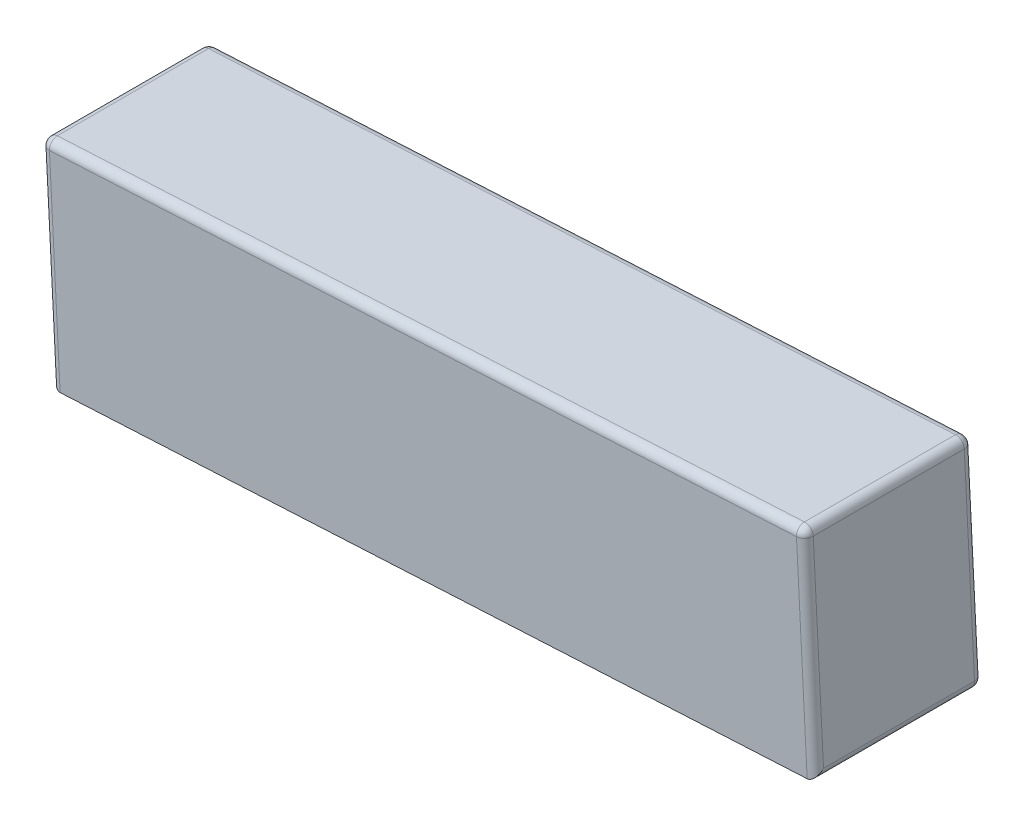
ISO-10303-21;
HEADER;
FILE_DESCRIPTION(('STEP AP214'),'2;1');
FILE_NAME('part.step','',(''),(''),'','','');
FILE_SCHEMA(('AUTOMOTIVE_DESIGN { 1 0 10303 214 1 1 1 1 }'));
ENDSEC;
DATA;
#1=APPLICATION_CONTEXT('core data for automotive mechanical design processes');
#2=APPLICATION_PROTOCOL_DEFINITION('international standard','automotive_design',2000,#1);
#3=PRODUCT_CONTEXT('',#1,'mechanical');
#4=PRODUCT('Part','Part','',(#3));
#5=PRODUCT_RELATED_PRODUCT_CATEGORY('part','',(#4));
#6=PRODUCT_DEFINITION_FORMATION('','',#4);
#7=PRODUCT_DEFINITION_CONTEXT('part definition',#1,'design');
#8=PRODUCT_DEFINITION('design','',#6,#7);
#9=PRODUCT_DEFINITION_SHAPE('','',#8);
#10=(LENGTH_UNIT() NAMED_UNIT(*) SI_UNIT(.MILLI.,.METRE.));
#11=(NAMED_UNIT(*) PLANE_ANGLE_UNIT() SI_UNIT($,.RADIAN.));
#12=(NAMED_UNIT(*) SI_UNIT($,.STERADIAN.) SOLID_ANGLE_UNIT());
#13=UNCERTAINTY_MEASURE_WITH_UNIT(LENGTH_MEASURE(1.E-05),#10,'distance_accuracy_value','');
#14=(GEOMETRIC_REPRESENTATION_CONTEXT(3) GLOBAL_UNCERTAINTY_ASSIGNED_CONTEXT((#13)) GLOBAL_UNIT_ASSIGNED_CONTEXT((#10,
#11,#12)) REPRESENTATION_CONTEXT('',''));
#15=CARTESIAN_POINT('',(0.,0.,0.));
#16=DIRECTION('',(0.,0.,1.));
#17=DIRECTION('',(1.,0.,0.));
#18=AXIS2_PLACEMENT_3D('',#15,#16,#17);
#19=CARTESIAN_POINT('',(182.046599503299,9.52860989135729,40.));
#20=DIRECTION('',(0.0522700461397748,-0.998632986775695,0.));
#21=DIRECTION('',(0.998632986775695,0.0522700461397748,0.));
#22=AXIS2_PLACEMENT_3D('',#19,#20,#21);
#23=PLANE('',#22);
#24=DIRECTION('',(-0.998632986775695,-0.0522700461397748,0.));
#25=VECTOR('',#24,1.);
#26=CARTESIAN_POINT('',(182.046599503299,9.52860989135729,2.));
#27=LINE('',#26,#25);
#28=CARTESIAN_POINT('',(180.049333529748,9.42406979907774,2.));
#29=VERTEX_POINT('',#28);
#30=CARTESIAN_POINT('',(1.99726597355135,0.104540092279545,2.));
#31=VERTEX_POINT('',#30);
#32=EDGE_CURVE('E193',#29,#31,#27,.T.);
#33=ORIENTED_EDGE('',*,*,#32,.T.);
#34=DIRECTION('',(0.,0.,-1.));
#35=VECTOR('',#34,1.);
#36=CARTESIAN_POINT('',(1.99726597355135,0.104540092279545,40.));
#37=LINE('',#36,#35);
#38=CARTESIAN_POINT('',(1.99726597355135,0.104540092279545,38.));
#39=VERTEX_POINT('',#38);
#40=EDGE_CURVE('E241',#31,#39,#37,.F.);
#41=ORIENTED_EDGE('',*,*,#40,.T.);
#42=DIRECTION('',(-0.998632986775695,-0.0522700461397748,0.));
#43=VECTOR('',#42,1.);
#44=CARTESIAN_POINT('',(182.046599503299,9.52860989135729,38.));
#45=LINE('',#44,#43);
#46=CARTESIAN_POINT('',(180.049333529748,9.42406979907774,38.));
#47=VERTEX_POINT('',#46);
#48=EDGE_CURVE('E187',#39,#47,#45,.F.);
#49=ORIENTED_EDGE('',*,*,#48,.T.);
#50=DIRECTION('',(0.,0.,-1.));
#51=VECTOR('',#50,1.);
#52=CARTESIAN_POINT('',(180.049333529748,9.42406979907774,40.));
#53=LINE('',#52,#51);
#54=EDGE_CURVE('E190',#47,#29,#53,.T.);
#55=ORIENTED_EDGE('',*,*,#54,.T.);
#56=EDGE_LOOP('',(#33,#41,#49,#55));
#57=FACE_BOUND('',#56,.T.);
#58=ADVANCED_FACE('F41',(#57),#23,.F.);
#59=CARTESIAN_POINT('',(0.,0.,40.));
#60=DIRECTION('',(0.998632986775695,0.0522700461397748,0.));
#61=DIRECTION('',(-0.0522700461397748,0.998632986775695,0.));
#62=AXIS2_PLACEMENT_3D('',#59,#60,#61);
#63=PLANE('',#62);
#64=DIRECTION('',(0.,0.,-1.));
#65=VECTOR('',#64,1.);
#66=CARTESIAN_POINT('',(2.54889073314788,-48.6972282175094,40.));
#67=LINE('',#66,#65);
#68=CARTESIAN_POINT('',(2.54889073314788,-48.6972282175094,2.));
#69=VERTEX_POINT('',#68);
#70=CARTESIAN_POINT('',(2.54889073314788,-48.6972282175094,38.));
#71=VERTEX_POINT('',#70);
#72=EDGE_CURVE('E219',#69,#71,#67,.F.);
#73=ORIENTED_EDGE('',*,*,#72,.T.);
#74=DIRECTION('',(0.0522700461397748,-0.998632986775695,0.));
#75=VECTOR('',#74,1.);
#76=CARTESIAN_POINT('',(0.10454009227955,-1.99726597355139,38.));
#77=LINE('',#76,#75);
#78=CARTESIAN_POINT('',(0.10454009227955,-1.99726597355139,38.));
#79=VERTEX_POINT('',#78);
#80=EDGE_CURVE('E225',#71,#79,#77,.F.);
#81=ORIENTED_EDGE('',*,*,#80,.T.);
#82=DIRECTION('',(0.,0.,-1.));
#83=VECTOR('',#82,1.);
#84=CARTESIAN_POINT('',(0.10454009227955,-1.99726597355139,40.));
#85=LINE('',#84,#83);
#86=CARTESIAN_POINT('',(0.10454009227955,-1.99726597355139,2.));
#87=VERTEX_POINT('',#86);
#88=EDGE_CURVE('E222',#79,#87,#85,.T.);
#89=ORIENTED_EDGE('',*,*,#88,.T.);
#90=DIRECTION('',(0.0522700461397748,-0.998632986775695,0.));
#91=VECTOR('',#90,1.);
#92=CARTESIAN_POINT('',(0.,0.,2.));
#93=LINE('',#92,#91);
#94=EDGE_CURVE('E216',#87,#69,#93,.T.);
#95=ORIENTED_EDGE('',*,*,#94,.T.);
#96=EDGE_LOOP('',(#73,#81,#89,#95));
#97=FACE_BOUND('',#96,.T.);
#98=ADVANCED_FACE('F344',(#97),#63,.F.);
#99=CARTESIAN_POINT('',(2.65343082542743,-50.6944941910608,40.));
#100=DIRECTION('',(-0.0522700461397748,0.998632986775695,0.));
#101=DIRECTION('',(-0.998632986775695,-0.0522700461397748,0.));
#102=AXIS2_PLACEMENT_3D('',#99,#100,#101);
#103=PLANE('',#102);
#104=DIRECTION('',(0.998632986775695,0.0522700461397748,0.));
#105=VECTOR('',#104,1.);
#106=CARTESIAN_POINT('',(2.65343082542743,-50.6944941910608,40.));
#107=LINE('',#106,#105);
#108=CARTESIAN_POINT('',(4.65069679897882,-50.5899540987813,40.));
#109=VERTEX_POINT('',#108);
#110=CARTESIAN_POINT('',(182.702764355175,-41.2704243919831,40.));
#111=VERTEX_POINT('',#110);
#112=EDGE_CURVE('E159',#109,#111,#107,.T.);
#113=ORIENTED_EDGE('',*,*,#112,.F.);
#114=DIRECTION('',(0.,0.,-1.));
#115=VECTOR('',#114,1.);
#116=CARTESIAN_POINT('',(4.65069679897882,-50.5899540987813,40.));
#117=LINE('',#116,#115);
#118=CARTESIAN_POINT('',(4.65069679897882,-50.5899540987813,2.));
#119=VERTEX_POINT('',#118);
#120=EDGE_CURVE('E65',#109,#119,#117,.T.);
#121=ORIENTED_EDGE('',*,*,#120,.T.);
#122=DIRECTION('',(0.998632986775695,0.0522700461397748,0.));
#123=VECTOR('',#122,1.);
#124=CARTESIAN_POINT('',(2.65343082542743,-50.6944941910608,2.));
#125=LINE('',#124,#123);
#126=CARTESIAN_POINT('',(182.702764355175,-41.2704243919831,2.));
#127=VERTEX_POINT('',#126);
#128=EDGE_CURVE('E244',#119,#127,#125,.T.);
#129=ORIENTED_EDGE('',*,*,#128,.T.);
#130=DIRECTION('',(0.,0.,-1.));
#131=VECTOR('',#130,1.);
#132=CARTESIAN_POINT('',(182.702764355175,-41.2704243919831,40.));
#133=LINE('',#132,#131);
#134=EDGE_CURVE('E184',#127,#111,#133,.F.);
#135=ORIENTED_EDGE('',*,*,#134,.T.);
#136=EDGE_LOOP('',(#113,#121,#129,#135));
#137=FACE_BOUND('',#136,.T.);
#138=ADVANCED_FACE('F295',(#137),#103,.F.);
#139=CARTESIAN_POINT('',(184.700030328727,-41.1658842997035,40.));
#140=DIRECTION('',(-0.998632986775695,-0.0522700461397748,0.));
#141=DIRECTION('',(0.0522700461397748,-0.998632986775695,0.));
#142=AXIS2_PLACEMENT_3D('',#139,#140,#141);
#143=PLANE('',#142);
#144=DIRECTION('',(-0.0522700461397748,0.998632986775695,0.));
#145=VECTOR('',#144,1.);
#146=CARTESIAN_POINT('',(184.700030328727,-41.1658842997035,38.));
#147=LINE('',#146,#145);
#148=CARTESIAN_POINT('',(182.151139595579,7.5313439178059,38.));
#149=VERTEX_POINT('',#148);
#150=CARTESIAN_POINT('',(184.595490236447,-39.1686183261521,38.));
#151=VERTEX_POINT('',#150);
#152=EDGE_CURVE('E158',#149,#151,#147,.F.);
#153=ORIENTED_EDGE('',*,*,#152,.T.);
#154=DIRECTION('',(0.,0.,-1.));
#155=VECTOR('',#154,1.);
#156=CARTESIAN_POINT('',(184.595490236447,-39.1686183261521,40.));
#157=LINE('',#156,#155);
#158=CARTESIAN_POINT('',(184.595490236447,-39.1686183261521,2.));
#159=VERTEX_POINT('',#158);
#160=EDGE_CURVE('E164',#151,#159,#157,.T.);
#161=ORIENTED_EDGE('',*,*,#160,.T.);
#162=DIRECTION('',(-0.0522700461397748,0.998632986775695,0.));
#163=VECTOR('',#162,1.);
#164=CARTESIAN_POINT('',(184.700030328727,-41.1658842997035,2.));
#165=LINE('',#164,#163);
#166=CARTESIAN_POINT('',(182.151139595579,7.5313439178059,2.));
#167=VERTEX_POINT('',#166);
#168=EDGE_CURVE('E132',#159,#167,#165,.T.);
#169=ORIENTED_EDGE('',*,*,#168,.T.);
#170=DIRECTION('',(0.,0.,-1.));
#171=VECTOR('',#170,1.);
#172=CARTESIAN_POINT('',(182.151139595579,7.5313439178059,40.));
#173=LINE('',#172,#171);
#174=EDGE_CURVE('E151',#167,#149,#173,.F.);
#175=ORIENTED_EDGE('',*,*,#174,.T.);
#176=EDGE_LOOP('',(#153,#161,#169,#175));
#177=FACE_BOUND('',#176,.T.);
#178=ADVANCED_FACE('F162',(#177),#143,.F.);
#179=CARTESIAN_POINT('',(0.,0.,40.));
#180=DIRECTION('',(0.,0.,1.));
#181=DIRECTION('',(1.,0.,0.));
#182=AXIS2_PLACEMENT_3D('',#179,#180,#181);
#183=PLANE('',#182);
#184=DIRECTION('',(-0.998632986775695,-0.0522700461397748,0.));
#185=VECTOR('',#184,1.);
#186=CARTESIAN_POINT('',(0.10454009227955,-1.99726597355139,40.));
#187=LINE('',#186,#185);
#188=CARTESIAN_POINT('',(180.153873622027,7.42680382552635,40.));
#189=VERTEX_POINT('',#188);
#190=CARTESIAN_POINT('',(2.10180606583094,-1.89272588127184,40.));
#191=VERTEX_POINT('',#190);
#192=EDGE_CURVE('E177',#189,#191,#187,.T.);
#193=ORIENTED_EDGE('',*,*,#192,.T.);
#194=DIRECTION('',(0.0522700461397748,-0.998632986775695,0.));
#195=VECTOR('',#194,1.);
#196=CARTESIAN_POINT('',(4.65069679897883,-50.5899540987813,40.));
#197=LINE('',#196,#195);
#198=EDGE_CURVE('E196',#191,#109,#197,.T.);
#199=ORIENTED_EDGE('',*,*,#198,.T.);
#200=ORIENTED_EDGE('',*,*,#112,.T.);
#201=DIRECTION('',(-0.0522700461397748,0.998632986775695,0.));
#202=VECTOR('',#201,1.);
#203=CARTESIAN_POINT('',(180.049333529748,9.42406979907774,40.));
#204=LINE('',#203,#202);
#205=EDGE_CURVE('E181',#111,#189,#204,.T.);
#206=ORIENTED_EDGE('',*,*,#205,.T.);
#207=EDGE_LOOP('',(#193,#199,#200,#206));
#208=FACE_BOUND('',#207,.T.);
#209=ADVANCED_FACE('F298',(#208),#183,.T.);
#210=CARTESIAN_POINT('',(0.,0.,0.));
#211=DIRECTION('',(0.,0.,1.));
#212=DIRECTION('',(1.,0.,0.));
#213=AXIS2_PLACEMENT_3D('',#210,#211,#212);
#214=PLANE('',#213);
#215=DIRECTION('',(0.998632986775695,0.0522700461397748,0.));
#216=VECTOR('',#215,1.);
#217=CARTESIAN_POINT('',(2.54889073314788,-48.6972282175094,0.));
#218=LINE('',#217,#216);
#219=CARTESIAN_POINT('',(182.598224262896,-39.2731584184317,0.));
#220=VERTEX_POINT('',#219);
#221=CARTESIAN_POINT('',(4.54615670669927,-48.5926881252299,0.));
#222=VERTEX_POINT('',#221);
#223=EDGE_CURVE('E51',#220,#222,#218,.F.);
#224=ORIENTED_EDGE('',*,*,#223,.T.);
#225=DIRECTION('',(0.0522700461397748,-0.998632986775695,0.));
#226=VECTOR('',#225,1.);
#227=CARTESIAN_POINT('',(1.99726597355139,0.10454009227955,0.));
#228=LINE('',#227,#226);
#229=CARTESIAN_POINT('',(2.10180606583094,-1.89272588127184,0.));
#230=VERTEX_POINT('',#229);
#231=EDGE_CURVE('E11',#222,#230,#228,.F.);
#232=ORIENTED_EDGE('',*,*,#231,.T.);
#233=DIRECTION('',(-0.998632986775695,-0.0522700461397748,0.));
#234=VECTOR('',#233,1.);
#235=CARTESIAN_POINT('',(0.10454009227955,-1.99726597355139,0.));
#236=LINE('',#235,#234);
#237=CARTESIAN_POINT('',(180.153873622027,7.42680382552635,0.));
#238=VERTEX_POINT('',#237);
#239=EDGE_CURVE('E169',#230,#238,#236,.F.);
#240=ORIENTED_EDGE('',*,*,#239,.T.);
#241=DIRECTION('',(-0.0522700461397748,0.998632986775695,0.));
#242=VECTOR('',#241,1.);
#243=CARTESIAN_POINT('',(180.049333529748,9.42406979907774,0.));
#244=LINE('',#243,#242);
#245=EDGE_CURVE('E134',#238,#220,#244,.F.);
#246=ORIENTED_EDGE('',*,*,#245,.T.);
#247=EDGE_LOOP('',(#224,#232,#240,#246));
#248=FACE_BOUND('',#247,.T.);
#249=ADVANCED_FACE('F331',(#248),#214,.F.);
#250=CARTESIAN_POINT('',(0.10454009227955,-1.99726597355139,38.));
#251=DIRECTION('',(0.998632986775695,0.0522700461397748,0.));
#252=DIRECTION('',(-0.0522700461397748,0.998632986775695,0.));
#253=AXIS2_PLACEMENT_3D('',#250,#251,#252);
#254=CYLINDRICAL_SURFACE('',#253,2.);
#255=ORIENTED_EDGE('',*,*,#48,.F.);
#256=CARTESIAN_POINT('',(2.10180606583094,-1.89272588127184,38.));
#257=DIRECTION('',(0.998632986775695,0.0522700461397748,0.));
#258=DIRECTION('',(-0.0522700461397748,0.998632986775695,0.));
#259=AXIS2_PLACEMENT_3D('',#256,#257,#258);
#260=CIRCLE('',#259,2.);
#261=EDGE_CURVE('E229',#39,#191,#260,.T.);
#262=ORIENTED_EDGE('',*,*,#261,.T.);
#263=ORIENTED_EDGE('',*,*,#192,.F.);
#264=CARTESIAN_POINT('',(180.153873622027,7.42680382552635,38.));
#265=DIRECTION('',(0.998632986775695,0.0522700461397796,0.));
#266=DIRECTION('',(-0.0522700461397796,0.998632986775695,0.));
#267=AXIS2_PLACEMENT_3D('',#264,#265,#266);
#268=CIRCLE('',#267,2.);
#269=EDGE_CURVE('E209',#47,#189,#268,.T.);
#270=ORIENTED_EDGE('',*,*,#269,.F.);
#271=EDGE_LOOP('',(#255,#262,#263,#270));
#272=FACE_BOUND('',#271,.T.);
#273=ADVANCED_FACE('F311',(#272),#254,.T.);
#274=CARTESIAN_POINT('',(180.153873622027,7.42680382552635,38.));
#275=DIRECTION('',(0.,0.,1.));
#276=DIRECTION('',(0.,-1.,0.));
#277=AXIS2_PLACEMENT_3D('',#274,#275,#276);
#278=SPHERICAL_SURFACE('',#277,2.);
#279=CARTESIAN_POINT('',(180.153873622028,7.42680382552635,38.));
#280=DIRECTION('',(0.,0.,1.));
#281=DIRECTION('',(1.,0.,0.));
#282=AXIS2_PLACEMENT_3D('',#279,#280,#281);
#283=CIRCLE('',#282,2.);
#284=EDGE_CURVE('E154',#47,#149,#283,.F.);
#285=ORIENTED_EDGE('',*,*,#284,.F.);
#286=ORIENTED_EDGE('',*,*,#269,.T.);
#287=CARTESIAN_POINT('',(180.153873622027,7.42680382552635,38.));
#288=DIRECTION('',(-0.0522700461397749,0.998632986775695,0.));
#289=DIRECTION('',(-0.998632986775695,-0.0522700461397749,0.));
#290=AXIS2_PLACEMENT_3D('',#287,#288,#289);
#291=CIRCLE('',#290,2.);
#292=EDGE_CURVE('E205',#149,#189,#291,.F.);
#293=ORIENTED_EDGE('',*,*,#292,.F.);
#294=EDGE_LOOP('',(#285,#286,#293));
#295=FACE_BOUND('',#294,.T.);
#296=ADVANCED_FACE('F307',(#295),#278,.T.);
#297=CARTESIAN_POINT('',(180.049333529748,9.42406979907774,38.));
#298=DIRECTION('',(0.0522700461397748,-0.998632986775695,0.));
#299=DIRECTION('',(0.998632986775695,0.0522700461397748,0.));
#300=AXIS2_PLACEMENT_3D('',#297,#298,#299);
#301=CYLINDRICAL_SURFACE('',#300,2.);
#302=ORIENTED_EDGE('',*,*,#292,.T.);
#303=ORIENTED_EDGE('',*,*,#205,.F.);
#304=CARTESIAN_POINT('',(182.598224262896,-39.2731584184317,38.));
#305=DIRECTION('',(0.0369605040783685,-0.70614015686567,-0.707106781186547));
#306=DIRECTION('',(-0.0369605040783685,0.70614015686567,-0.707106781186547));
#307=AXIS2_PLACEMENT_3D('',#304,#305,#306);
#308=ELLIPSE('',#307,2.82842712474619,2.);
#309=EDGE_CURVE('E148',#151,#111,#308,.T.);
#310=ORIENTED_EDGE('',*,*,#309,.F.);
#311=ORIENTED_EDGE('',*,*,#152,.F.);
#312=EDGE_LOOP('',(#302,#303,#310,#311));
#313=FACE_BOUND('',#312,.T.);
#314=ADVANCED_FACE('F304',(#313),#301,.T.);
#315=CARTESIAN_POINT('',(180.153873622027,7.42680382552635,40.));
#316=DIRECTION('',(0.,0.,-1.));
#317=DIRECTION('',(-1.,0.,0.));
#318=AXIS2_PLACEMENT_3D('',#315,#316,#317);
#319=CYLINDRICAL_SURFACE('',#318,2.);
#320=ORIENTED_EDGE('',*,*,#284,.T.);
#321=ORIENTED_EDGE('',*,*,#174,.F.);
#322=CARTESIAN_POINT('',(180.153873622027,7.42680382552635,2.));
#323=DIRECTION('',(0.,0.,-1.));
#324=DIRECTION('',(-1.,0.,0.));
#325=AXIS2_PLACEMENT_3D('',#322,#323,#324);
#326=CIRCLE('',#325,2.);
#327=EDGE_CURVE('E141',#29,#167,#326,.T.);
#328=ORIENTED_EDGE('',*,*,#327,.F.);
#329=ORIENTED_EDGE('',*,*,#54,.F.);
#330=EDGE_LOOP('',(#320,#321,#328,#329));
#331=FACE_BOUND('',#330,.T.);
#332=ADVANCED_FACE('F152',(#331),#319,.T.);
#333=CARTESIAN_POINT('',(182.151139595579,7.5313439178059,2.));
#334=DIRECTION('',(-0.998632986775695,-0.0522700461397748,0.));
#335=DIRECTION('',(0.0522700461397748,-0.998632986775695,0.));
#336=AXIS2_PLACEMENT_3D('',#333,#334,#335);
#337=CYLINDRICAL_SURFACE('',#336,2.);
#338=ORIENTED_EDGE('',*,*,#239,.F.);
#339=CARTESIAN_POINT('',(2.10180606583088,-1.89272588127185,2.));
#340=DIRECTION('',(-0.998632986775695,-0.0522700461397748,0.));
#341=DIRECTION('',(0.0522700461397748,-0.998632986775695,0.));
#342=AXIS2_PLACEMENT_3D('',#339,#340,#341);
#343=CIRCLE('',#342,2.);
#344=EDGE_CURVE('E232',#230,#31,#343,.F.);
#345=ORIENTED_EDGE('',*,*,#344,.T.);
#346=ORIENTED_EDGE('',*,*,#32,.F.);
#347=CARTESIAN_POINT('',(180.153873622027,7.42680382552635,2.));
#348=DIRECTION('',(0.998632986775695,0.0522700461397795,0.));
#349=DIRECTION('',(-0.0522700461397796,0.998632986775695,0.));
#350=AXIS2_PLACEMENT_3D('',#347,#348,#349);
#351=CIRCLE('',#350,2.);
#352=EDGE_CURVE('E138',#238,#29,#351,.T.);
#353=ORIENTED_EDGE('',*,*,#352,.F.);
#354=EDGE_LOOP('',(#338,#345,#346,#353));
#355=FACE_BOUND('',#354,.T.);
#356=ADVANCED_FACE('F334',(#355),#337,.T.);
#357=CARTESIAN_POINT('',(182.598224262896,-39.2731584184317,40.));
#358=DIRECTION('',(0.,0.,-1.));
#359=DIRECTION('',(-1.,0.,0.));
#360=AXIS2_PLACEMENT_3D('',#357,#358,#359);
#361=CYLINDRICAL_SURFACE('',#360,2.);
#362=ORIENTED_EDGE('',*,*,#134,.F.);
#363=CARTESIAN_POINT('',(182.598224262896,-39.2731584184317,2.));
#364=DIRECTION('',(0.,0.,-1.));
#365=DIRECTION('',(-1.,0.,0.));
#366=AXIS2_PLACEMENT_3D('',#363,#364,#365);
#367=CIRCLE('',#366,2.);
#368=EDGE_CURVE('E238',#127,#159,#367,.F.);
#369=ORIENTED_EDGE('',*,*,#368,.T.);
#370=ORIENTED_EDGE('',*,*,#160,.F.);
#371=ORIENTED_EDGE('',*,*,#309,.T.);
#372=EDGE_LOOP('',(#362,#369,#370,#371));
#373=FACE_BOUND('',#372,.T.);
#374=ADVANCED_FACE('F292',(#373),#361,.T.);
#375=CARTESIAN_POINT('',(180.153873622027,7.42680382552635,2.));
#376=DIRECTION('',(-0.0522700461397796,0.998632986775695,0.));
#377=DIRECTION('',(-0.998632986775695,-0.0522700461397796,0.));
#378=AXIS2_PLACEMENT_3D('',#375,#376,#377);
#379=SPHERICAL_SURFACE('',#378,2.);
#380=ORIENTED_EDGE('',*,*,#352,.T.);
#381=ORIENTED_EDGE('',*,*,#327,.T.);
#382=CARTESIAN_POINT('',(180.153873622028,7.42680382552635,2.));
#383=DIRECTION('',(-0.0522700461397752,0.998632986775695,0.));
#384=DIRECTION('',(-0.998632986775695,-0.0522700461397752,0.));
#385=AXIS2_PLACEMENT_3D('',#382,#383,#384);
#386=CIRCLE('',#385,2.);
#387=EDGE_CURVE('E128',#238,#167,#386,.F.);
#388=ORIENTED_EDGE('',*,*,#387,.F.);
#389=EDGE_LOOP('',(#380,#381,#388));
#390=FACE_BOUND('',#389,.T.);
#391=ADVANCED_FACE('F143',(#390),#379,.T.);
#392=CARTESIAN_POINT('',(182.702764355175,-41.2704243919831,2.));
#393=DIRECTION('',(-0.0522700461397748,0.998632986775695,0.));
#394=DIRECTION('',(-0.998632986775695,-0.0522700461397748,0.));
#395=AXIS2_PLACEMENT_3D('',#392,#393,#394);
#396=CYLINDRICAL_SURFACE('',#395,2.);
#397=ORIENTED_EDGE('',*,*,#168,.F.);
#398=CARTESIAN_POINT('',(182.598224262896,-39.2731584184317,2.));
#399=DIRECTION('',(-0.0522700461397748,0.998632986775695,0.));
#400=DIRECTION('',(-0.998632986775695,-0.0522700461397748,0.));
#401=AXIS2_PLACEMENT_3D('',#398,#399,#400);
#402=CIRCLE('',#401,2.);
#403=EDGE_CURVE('E235',#159,#220,#402,.T.);
#404=ORIENTED_EDGE('',*,*,#403,.T.);
#405=ORIENTED_EDGE('',*,*,#245,.F.);
#406=ORIENTED_EDGE('',*,*,#387,.T.);
#407=EDGE_LOOP('',(#397,#404,#405,#406));
#408=FACE_BOUND('',#407,.T.);
#409=ADVANCED_FACE('F130',(#408),#396,.T.);
#410=CARTESIAN_POINT('',(182.598224262896,-39.2731584184317,2.));
#411=DIRECTION('',(0.,0.,1.));
#412=DIRECTION('',(1.,0.,0.));
#413=AXIS2_PLACEMENT_3D('',#410,#411,#412);
#414=SPHERICAL_SURFACE('',#413,2.);
#415=ORIENTED_EDGE('',*,*,#403,.F.);
#416=ORIENTED_EDGE('',*,*,#368,.F.);
#417=CARTESIAN_POINT('',(182.598224262896,-39.2731584184317,2.));
#418=DIRECTION('',(-0.998632986775694,-0.0522700461397934,0.));
#419=DIRECTION('',(0.0522700461397934,-0.998632986775694,0.));
#420=AXIS2_PLACEMENT_3D('',#417,#418,#419);
#421=CIRCLE('',#420,2.);
#422=EDGE_CURVE('E45',#220,#127,#421,.T.);
#423=ORIENTED_EDGE('',*,*,#422,.F.);
#424=EDGE_LOOP('',(#415,#416,#423));
#425=FACE_BOUND('',#424,.T.);
#426=ADVANCED_FACE('F43',(#425),#414,.T.);
#427=CARTESIAN_POINT('',(2.10180606583091,-1.89272588127185,2.));
#428=DIRECTION('',(0.998632986775695,0.0522700461397748,0.));
#429=DIRECTION('',(-0.0522700461397748,0.998632986775695,0.));
#430=AXIS2_PLACEMENT_3D('',#427,#428,#429);
#431=SPHERICAL_SURFACE('',#430,2.);
#432=CARTESIAN_POINT('',(2.10180606583089,-1.89272588127185,2.));
#433=DIRECTION('',(0.,0.,1.));
#434=DIRECTION('',(1.,0.,0.));
#435=AXIS2_PLACEMENT_3D('',#432,#433,#434);
#436=CIRCLE('',#435,2.);
#437=EDGE_CURVE('E273',#31,#87,#436,.T.);
#438=ORIENTED_EDGE('',*,*,#437,.F.);
#439=ORIENTED_EDGE('',*,*,#344,.F.);
#440=CARTESIAN_POINT('',(2.10180606583092,-1.89272588127184,2.));
#441=DIRECTION('',(0.0522700461397748,-0.998632986775695,0.));
#442=DIRECTION('',(0.998632986775695,0.0522700461397748,0.));
#443=AXIS2_PLACEMENT_3D('',#440,#441,#442);
#444=CIRCLE('',#443,2.);
#445=EDGE_CURVE('E276',#87,#230,#444,.T.);
#446=ORIENTED_EDGE('',*,*,#445,.F.);
#447=EDGE_LOOP('',(#438,#439,#446));
#448=FACE_BOUND('',#447,.T.);
#449=ADVANCED_FACE('F338',(#448),#431,.T.);
#450=CARTESIAN_POINT('',(2.54889073314788,-48.6972282175094,2.));
#451=DIRECTION('',(0.998632986775695,0.0522700461397748,0.));
#452=DIRECTION('',(-0.0522700461397748,0.998632986775695,0.));
#453=AXIS2_PLACEMENT_3D('',#450,#451,#452);
#454=CYLINDRICAL_SURFACE('',#453,2.);
#455=ORIENTED_EDGE('',*,*,#422,.T.);
#456=ORIENTED_EDGE('',*,*,#128,.F.);
#457=CARTESIAN_POINT('',(4.54615670669927,-48.5926881252299,2.));
#458=DIRECTION('',(-0.998632986775695,-0.0522700461397753,0.));
#459=DIRECTION('',(0.0522700461397753,-0.998632986775695,0.));
#460=AXIS2_PLACEMENT_3D('',#457,#458,#459);
#461=CIRCLE('',#460,2.);
#462=EDGE_CURVE('E269',#222,#119,#461,.T.);
#463=ORIENTED_EDGE('',*,*,#462,.F.);
#464=ORIENTED_EDGE('',*,*,#223,.F.);
#465=EDGE_LOOP('',(#455,#456,#463,#464));
#466=FACE_BOUND('',#465,.T.);
#467=ADVANCED_FACE('F286',(#466),#454,.T.);
#468=CARTESIAN_POINT('',(1.99726597355139,0.10454009227955,2.));
#469=DIRECTION('',(0.0522700461397748,-0.998632986775695,0.));
#470=DIRECTION('',(0.998632986775695,0.0522700461397748,0.));
#471=AXIS2_PLACEMENT_3D('',#468,#469,#470);
#472=CYLINDRICAL_SURFACE('',#471,2.);
#473=ORIENTED_EDGE('',*,*,#445,.T.);
#474=ORIENTED_EDGE('',*,*,#231,.F.);
#475=CARTESIAN_POINT('',(4.54615670669927,-48.5926881252299,2.));
#476=DIRECTION('',(0.0522700461397761,-0.998632986775695,0.));
#477=DIRECTION('',(0.998632986775695,0.0522700461397761,0.));
#478=AXIS2_PLACEMENT_3D('',#475,#476,#477);
#479=CIRCLE('',#478,2.);
#480=EDGE_CURVE('E265',#69,#222,#479,.T.);
#481=ORIENTED_EDGE('',*,*,#480,.F.);
#482=ORIENTED_EDGE('',*,*,#94,.F.);
#483=EDGE_LOOP('',(#473,#474,#481,#482));
#484=FACE_BOUND('',#483,.T.);
#485=ADVANCED_FACE('F329',(#484),#472,.T.);
#486=CARTESIAN_POINT('',(2.10180606583094,-1.89272588127184,40.));
#487=DIRECTION('',(0.,0.,-1.));
#488=DIRECTION('',(-1.,0.,0.));
#489=AXIS2_PLACEMENT_3D('',#486,#487,#488);
#490=CYLINDRICAL_SURFACE('',#489,2.);
#491=ORIENTED_EDGE('',*,*,#437,.T.);
#492=ORIENTED_EDGE('',*,*,#88,.F.);
#493=CARTESIAN_POINT('',(2.10180606583094,-1.89272588127184,38.));
#494=DIRECTION('',(0.,0.,1.));
#495=DIRECTION('',(1.,0.,0.));
#496=AXIS2_PLACEMENT_3D('',#493,#494,#495);
#497=CIRCLE('',#496,2.);
#498=EDGE_CURVE('E261',#39,#79,#497,.T.);
#499=ORIENTED_EDGE('',*,*,#498,.F.);
#500=ORIENTED_EDGE('',*,*,#40,.F.);
#501=EDGE_LOOP('',(#491,#492,#499,#500));
#502=FACE_BOUND('',#501,.T.);
#503=ADVANCED_FACE('F341',(#502),#490,.T.);
#504=CARTESIAN_POINT('',(4.54615670669927,-48.5926881252299,2.));
#505=DIRECTION('',(0.,0.,-1.));
#506=DIRECTION('',(-1.,0.,0.));
#507=AXIS2_PLACEMENT_3D('',#504,#505,#506);
#508=SPHERICAL_SURFACE('',#507,2.);
#509=ORIENTED_EDGE('',*,*,#480,.T.);
#510=ORIENTED_EDGE('',*,*,#462,.T.);
#511=CARTESIAN_POINT('',(4.54615670669927,-48.5926881252299,2.));
#512=DIRECTION('',(0.,0.,-1.));
#513=DIRECTION('',(-1.,0.,0.));
#514=AXIS2_PLACEMENT_3D('',#511,#512,#513);
#515=CIRCLE('',#514,2.);
#516=EDGE_CURVE('E257',#69,#119,#515,.F.);
#517=ORIENTED_EDGE('',*,*,#516,.F.);
#518=EDGE_LOOP('',(#509,#510,#517));
#519=FACE_BOUND('',#518,.T.);
#520=ADVANCED_FACE('F327',(#519),#508,.T.);
#521=CARTESIAN_POINT('',(2.10180606583094,-1.89272588127184,38.));
#522=DIRECTION('',(0.998632986775695,0.0522700461397748,0.));
#523=DIRECTION('',(-0.0522700461397748,0.998632986775695,0.));
#524=AXIS2_PLACEMENT_3D('',#521,#522,#523);
#525=SPHERICAL_SURFACE('',#524,2.);
#526=ORIENTED_EDGE('',*,*,#261,.F.);
#527=ORIENTED_EDGE('',*,*,#498,.T.);
#528=CARTESIAN_POINT('',(2.10180606583094,-1.89272588127184,38.));
#529=DIRECTION('',(0.0522700461397748,-0.998632986775695,0.));
#530=DIRECTION('',(0.998632986775695,0.0522700461397748,0.));
#531=AXIS2_PLACEMENT_3D('',#528,#529,#530);
#532=CIRCLE('',#531,2.);
#533=EDGE_CURVE('E254',#191,#79,#532,.T.);
#534=ORIENTED_EDGE('',*,*,#533,.F.);
#535=EDGE_LOOP('',(#526,#527,#534));
#536=FACE_BOUND('',#535,.T.);
#537=ADVANCED_FACE('F316',(#536),#525,.T.);
#538=CARTESIAN_POINT('',(4.54615670669927,-48.5926881252299,40.));
#539=DIRECTION('',(0.,0.,-1.));
#540=DIRECTION('',(-1.,0.,0.));
#541=AXIS2_PLACEMENT_3D('',#538,#539,#540);
#542=CYLINDRICAL_SURFACE('',#541,2.);
#543=ORIENTED_EDGE('',*,*,#516,.T.);
#544=ORIENTED_EDGE('',*,*,#120,.F.);
#545=CARTESIAN_POINT('',(4.54615670669927,-48.5926881252299,38.));
#546=DIRECTION('',(0.0369605040783685,-0.70614015686567,-0.707106781186547));
#547=DIRECTION('',(-0.0369605040783685,0.70614015686567,-0.707106781186547));
#548=AXIS2_PLACEMENT_3D('',#545,#546,#547);
#549=ELLIPSE('',#548,2.82842712474619,2.);
#550=EDGE_CURVE('E251',#71,#109,#549,.F.);
#551=ORIENTED_EDGE('',*,*,#550,.F.);
#552=ORIENTED_EDGE('',*,*,#72,.F.);
#553=EDGE_LOOP('',(#543,#544,#551,#552));
#554=FACE_BOUND('',#553,.T.);
#555=ADVANCED_FACE('F324',(#554),#542,.T.);
#556=CARTESIAN_POINT('',(1.99726597355139,0.10454009227955,38.));
#557=DIRECTION('',(-0.0522700461397748,0.998632986775695,0.));
#558=DIRECTION('',(-0.998632986775695,-0.0522700461397748,0.));
#559=AXIS2_PLACEMENT_3D('',#556,#557,#558);
#560=CYLINDRICAL_SURFACE('',#559,2.);
#561=ORIENTED_EDGE('',*,*,#533,.T.);
#562=ORIENTED_EDGE('',*,*,#80,.F.);
#563=ORIENTED_EDGE('',*,*,#550,.T.);
#564=ORIENTED_EDGE('',*,*,#198,.F.);
#565=EDGE_LOOP('',(#561,#562,#563,#564));
#566=FACE_BOUND('',#565,.T.);
#567=ADVANCED_FACE('F320',(#566),#560,.T.);
#568=CLOSED_SHELL('',(#58,#98,#138,#178,#209,#249,#273,#296,#314,#332,#356,#374,#391,#409,#426,
#449,#467,#485,#503,#520,#537,#555,#567));
#569=MANIFOLD_SOLID_BREP('B2',#568);
#570=ADVANCED_BREP_SHAPE_REPRESENTATION('',(#18,#569),#14);
#571=SHAPE_DEFINITION_REPRESENTATION(#9,#570);
ENDSEC;
END-ISO-10303-21;
